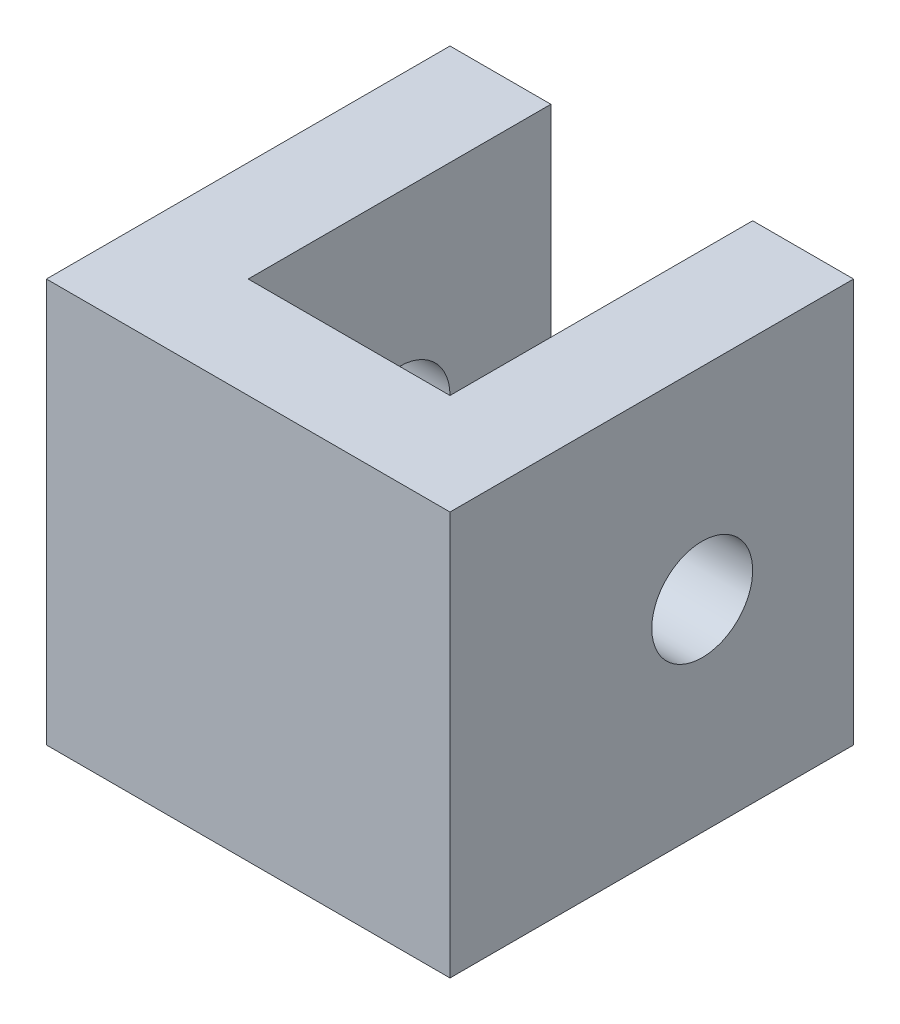
ISO-10303-21;
HEADER;
FILE_DESCRIPTION(('STEP AP214'),'2;1');
FILE_NAME('part.step','',(''),(''),'','','');
FILE_SCHEMA(('AUTOMOTIVE_DESIGN { 1 0 10303 214 1 1 1 1 }'));
ENDSEC;
DATA;
#1=APPLICATION_CONTEXT('core data for automotive mechanical design processes');
#2=APPLICATION_PROTOCOL_DEFINITION('international standard','automotive_design',2000,#1);
#3=PRODUCT_CONTEXT('',#1,'mechanical');
#4=PRODUCT('Part','Part','',(#3));
#5=PRODUCT_RELATED_PRODUCT_CATEGORY('part','',(#4));
#6=PRODUCT_DEFINITION_FORMATION('','',#4);
#7=PRODUCT_DEFINITION_CONTEXT('part definition',#1,'design');
#8=PRODUCT_DEFINITION('design','',#6,#7);
#9=PRODUCT_DEFINITION_SHAPE('','',#8);
#10=(LENGTH_UNIT() NAMED_UNIT(*) SI_UNIT(.MILLI.,.METRE.));
#11=(NAMED_UNIT(*) PLANE_ANGLE_UNIT() SI_UNIT($,.RADIAN.));
#12=(NAMED_UNIT(*) SI_UNIT($,.STERADIAN.) SOLID_ANGLE_UNIT());
#13=UNCERTAINTY_MEASURE_WITH_UNIT(LENGTH_MEASURE(1.E-05),#10,'distance_accuracy_value','');
#14=(GEOMETRIC_REPRESENTATION_CONTEXT(3) GLOBAL_UNCERTAINTY_ASSIGNED_CONTEXT((#13)) GLOBAL_UNIT_ASSIGNED_CONTEXT((#10,
#11,#12)) REPRESENTATION_CONTEXT('',''));
#15=CARTESIAN_POINT('',(0.,0.,0.));
#16=DIRECTION('',(0.,0.,1.));
#17=DIRECTION('',(1.,0.,0.));
#18=AXIS2_PLACEMENT_3D('',#15,#16,#17);
#19=CARTESIAN_POINT('',(-18.2955445544555,-12.7,-19.5529702970297));
#20=DIRECTION('',(0.,0.,-1.));
#21=DIRECTION('',(-1.,0.,0.));
#22=AXIS2_PLACEMENT_3D('',#19,#20,#21);
#23=PLANE('',#22);
#24=DIRECTION('',(0.,1.,0.));
#25=VECTOR('',#24,1.);
#26=CARTESIAN_POINT('',(-24.6455445544555,-12.7,-19.5529702970297));
#27=LINE('',#26,#25);
#28=CARTESIAN_POINT('',(-24.6455445544555,-12.7,-19.5529702970297));
#29=VERTEX_POINT('',#28);
#30=CARTESIAN_POINT('',(-24.6455445544555,12.7,-19.5529702970297));
#31=VERTEX_POINT('',#30);
#32=EDGE_CURVE('E37',#29,#31,#27,.T.);
#33=ORIENTED_EDGE('',*,*,#32,.T.);
#34=DIRECTION('',(-1.,0.,0.));
#35=VECTOR('',#34,1.);
#36=CARTESIAN_POINT('',(-18.2955445544555,12.7,-19.5529702970297));
#37=LINE('',#36,#35);
#38=CARTESIAN_POINT('',(-18.2955445544555,12.7,-19.5529702970297));
#39=VERTEX_POINT('',#38);
#40=EDGE_CURVE('E98',#39,#31,#37,.T.);
#41=ORIENTED_EDGE('',*,*,#40,.F.);
#42=DIRECTION('',(0.,1.,0.));
#43=VECTOR('',#42,1.);
#44=CARTESIAN_POINT('',(-18.2955445544555,-12.7,-19.5529702970297));
#45=LINE('',#44,#43);
#46=CARTESIAN_POINT('',(-18.2955445544555,-12.7,-19.5529702970297));
#47=VERTEX_POINT('',#46);
#48=EDGE_CURVE('E11',#47,#39,#45,.T.);
#49=ORIENTED_EDGE('',*,*,#48,.F.);
#50=DIRECTION('',(-1.,0.,0.));
#51=VECTOR('',#50,1.);
#52=CARTESIAN_POINT('',(-18.2955445544555,-12.7,-19.5529702970297));
#53=LINE('',#52,#51);
#54=EDGE_CURVE('E99',#47,#29,#53,.T.);
#55=ORIENTED_EDGE('',*,*,#54,.T.);
#56=EDGE_LOOP('',(#33,#41,#49,#55));
#57=FACE_BOUND('',#56,.T.);
#58=ADVANCED_FACE('F34',(#57),#23,.T.);
#59=CARTESIAN_POINT('',(-18.2955445544555,-12.7,-0.502970297029703));
#60=DIRECTION('',(1.,0.,0.));
#61=DIRECTION('',(0.,0.,-1.));
#62=AXIS2_PLACEMENT_3D('',#59,#60,#61);
#63=PLANE('',#62);
#64=CARTESIAN_POINT('',(-18.2955445544555,0.,-10.0279702970297));
#65=DIRECTION('',(1.,0.,0.));
#66=DIRECTION('',(0.,0.,-1.));
#67=AXIS2_PLACEMENT_3D('',#64,#65,#66);
#68=CIRCLE('',#67,3.175);
#69=CARTESIAN_POINT('',(-18.2955445544555,0.,-13.2029702970297));
#70=VERTEX_POINT('',#69);
#71=EDGE_CURVE('E117',#70,#70,#68,.T.);
#72=ORIENTED_EDGE('',*,*,#71,.F.);
#73=EDGE_LOOP('',(#72));
#74=FACE_BOUND('',#73,.T.);
#75=ORIENTED_EDGE('',*,*,#48,.T.);
#76=DIRECTION('',(0.,0.,-1.));
#77=VECTOR('',#76,1.);
#78=CARTESIAN_POINT('',(-18.2955445544555,12.7,-0.502970297029703));
#79=LINE('',#78,#77);
#80=CARTESIAN_POINT('',(-18.2955445544555,12.7,-0.502970297029703));
#81=VERTEX_POINT('',#80);
#82=EDGE_CURVE('E116',#81,#39,#79,.T.);
#83=ORIENTED_EDGE('',*,*,#82,.F.);
#84=DIRECTION('',(0.,1.,0.));
#85=VECTOR('',#84,1.);
#86=CARTESIAN_POINT('',(-18.2955445544555,-12.7,-0.502970297029703));
#87=LINE('',#86,#85);
#88=CARTESIAN_POINT('',(-18.2955445544555,-12.7,-0.502970297029703));
#89=VERTEX_POINT('',#88);
#90=EDGE_CURVE('E42',#89,#81,#87,.T.);
#91=ORIENTED_EDGE('',*,*,#90,.F.);
#92=DIRECTION('',(0.,0.,-1.));
#93=VECTOR('',#92,1.);
#94=CARTESIAN_POINT('',(-18.2955445544555,-12.7,-0.502970297029703));
#95=LINE('',#94,#93);
#96=EDGE_CURVE('E104',#89,#47,#95,.T.);
#97=ORIENTED_EDGE('',*,*,#96,.T.);
#98=EDGE_LOOP('',(#75,#83,#91,#97));
#99=FACE_BOUND('',#98,.T.);
#100=ADVANCED_FACE('F185',(#74,#99),#63,.T.);
#101=CARTESIAN_POINT('',(-5.59554455445548,-12.7,-0.502970297029706));
#102=DIRECTION('',(0.,0.,-1.));
#103=DIRECTION('',(-1.,0.,0.));
#104=AXIS2_PLACEMENT_3D('',#101,#102,#103);
#105=PLANE('',#104);
#106=ORIENTED_EDGE('',*,*,#90,.T.);
#107=DIRECTION('',(-1.,0.,0.));
#108=VECTOR('',#107,1.);
#109=CARTESIAN_POINT('',(-5.59554455445548,12.7,-0.502970297029706));
#110=LINE('',#109,#108);
#111=CARTESIAN_POINT('',(-5.59554455445548,12.7,-0.502970297029706));
#112=VERTEX_POINT('',#111);
#113=EDGE_CURVE('E134',#112,#81,#110,.T.);
#114=ORIENTED_EDGE('',*,*,#113,.F.);
#115=DIRECTION('',(0.,1.,0.));
#116=VECTOR('',#115,1.);
#117=CARTESIAN_POINT('',(-5.59554455445548,-12.7,-0.502970297029706));
#118=LINE('',#117,#116);
#119=CARTESIAN_POINT('',(-5.59554455445548,-12.7,-0.502970297029706));
#120=VERTEX_POINT('',#119);
#121=EDGE_CURVE('E156',#120,#112,#118,.T.);
#122=ORIENTED_EDGE('',*,*,#121,.F.);
#123=DIRECTION('',(-1.,0.,0.));
#124=VECTOR('',#123,1.);
#125=CARTESIAN_POINT('',(-5.59554455445548,-12.7,-0.502970297029706));
#126=LINE('',#125,#124);
#127=EDGE_CURVE('E152',#120,#89,#126,.T.);
#128=ORIENTED_EDGE('',*,*,#127,.T.);
#129=EDGE_LOOP('',(#106,#114,#122,#128));
#130=FACE_BOUND('',#129,.T.);
#131=ADVANCED_FACE('F184',(#130),#105,.T.);
#132=CARTESIAN_POINT('',(-5.59554455445548,-12.7,-19.5529702970297));
#133=DIRECTION('',(-1.,0.,0.));
#134=DIRECTION('',(0.,0.,1.));
#135=AXIS2_PLACEMENT_3D('',#132,#133,#134);
#136=PLANE('',#135);
#137=CARTESIAN_POINT('',(-5.59554455445548,0.,-10.0279702970297));
#138=DIRECTION('',(-1.,0.,0.));
#139=DIRECTION('',(0.,0.,1.));
#140=AXIS2_PLACEMENT_3D('',#137,#138,#139);
#141=CIRCLE('',#140,3.175);
#142=CARTESIAN_POINT('',(-5.59554455445548,0.,-6.85297029702971));
#143=VERTEX_POINT('',#142);
#144=EDGE_CURVE('E120',#143,#143,#141,.T.);
#145=ORIENTED_EDGE('',*,*,#144,.F.);
#146=EDGE_LOOP('',(#145));
#147=FACE_BOUND('',#146,.T.);
#148=ORIENTED_EDGE('',*,*,#121,.T.);
#149=DIRECTION('',(0.,0.,1.));
#150=VECTOR('',#149,1.);
#151=CARTESIAN_POINT('',(-5.59554455445548,12.7,-19.5529702970297));
#152=LINE('',#151,#150);
#153=CARTESIAN_POINT('',(-5.59554455445548,12.7,-19.5529702970297));
#154=VERTEX_POINT('',#153);
#155=EDGE_CURVE('E131',#154,#112,#152,.T.);
#156=ORIENTED_EDGE('',*,*,#155,.F.);
#157=DIRECTION('',(0.,1.,0.));
#158=VECTOR('',#157,1.);
#159=CARTESIAN_POINT('',(-5.59554455445548,-12.7,-19.5529702970297));
#160=LINE('',#159,#158);
#161=CARTESIAN_POINT('',(-5.59554455445548,-12.7,-19.5529702970297));
#162=VERTEX_POINT('',#161);
#163=EDGE_CURVE('E158',#162,#154,#160,.T.);
#164=ORIENTED_EDGE('',*,*,#163,.F.);
#165=DIRECTION('',(0.,0.,1.));
#166=VECTOR('',#165,1.);
#167=CARTESIAN_POINT('',(-5.59554455445548,-12.7,-19.5529702970297));
#168=LINE('',#167,#166);
#169=EDGE_CURVE('E149',#162,#120,#168,.T.);
#170=ORIENTED_EDGE('',*,*,#169,.T.);
#171=EDGE_LOOP('',(#148,#156,#164,#170));
#172=FACE_BOUND('',#171,.T.);
#173=ADVANCED_FACE('F180',(#147,#172),#136,.T.);
#174=CARTESIAN_POINT('',(0.754455445544521,-12.7,-19.5529702970297));
#175=DIRECTION('',(0.,0.,-1.));
#176=DIRECTION('',(-1.,0.,0.));
#177=AXIS2_PLACEMENT_3D('',#174,#175,#176);
#178=PLANE('',#177);
#179=ORIENTED_EDGE('',*,*,#163,.T.);
#180=DIRECTION('',(-1.,0.,0.));
#181=VECTOR('',#180,1.);
#182=CARTESIAN_POINT('',(0.754455445544521,12.7,-19.5529702970297));
#183=LINE('',#182,#181);
#184=CARTESIAN_POINT('',(0.754455445544521,12.7,-19.5529702970297));
#185=VERTEX_POINT('',#184);
#186=EDGE_CURVE('E128',#185,#154,#183,.T.);
#187=ORIENTED_EDGE('',*,*,#186,.F.);
#188=DIRECTION('',(0.,1.,0.));
#189=VECTOR('',#188,1.);
#190=CARTESIAN_POINT('',(0.754455445544521,-12.7,-19.5529702970297));
#191=LINE('',#190,#189);
#192=CARTESIAN_POINT('',(0.754455445544521,-12.7,-19.5529702970297));
#193=VERTEX_POINT('',#192);
#194=EDGE_CURVE('E160',#193,#185,#191,.T.);
#195=ORIENTED_EDGE('',*,*,#194,.F.);
#196=DIRECTION('',(-1.,0.,0.));
#197=VECTOR('',#196,1.);
#198=CARTESIAN_POINT('',(0.754455445544521,-12.7,-19.5529702970297));
#199=LINE('',#198,#197);
#200=EDGE_CURVE('E146',#193,#162,#199,.T.);
#201=ORIENTED_EDGE('',*,*,#200,.T.);
#202=EDGE_LOOP('',(#179,#187,#195,#201));
#203=FACE_BOUND('',#202,.T.);
#204=ADVANCED_FACE('F173',(#203),#178,.T.);
#205=CARTESIAN_POINT('',(0.754455445544521,-12.7,5.8470297029703));
#206=DIRECTION('',(1.,0.,0.));
#207=DIRECTION('',(0.,0.,-1.));
#208=AXIS2_PLACEMENT_3D('',#205,#206,#207);
#209=PLANE('',#208);
#210=CARTESIAN_POINT('',(0.754455445544519,0.,-10.0279702970297));
#211=DIRECTION('',(-1.,0.,0.));
#212=DIRECTION('',(0.,0.,1.));
#213=AXIS2_PLACEMENT_3D('',#210,#211,#212);
#214=CIRCLE('',#213,3.175);
#215=CARTESIAN_POINT('',(0.754455445544519,0.,-6.85297029702971));
#216=VERTEX_POINT('',#215);
#217=EDGE_CURVE('E216',#216,#216,#214,.T.);
#218=ORIENTED_EDGE('',*,*,#217,.T.);
#219=EDGE_LOOP('',(#218));
#220=FACE_BOUND('',#219,.T.);
#221=ORIENTED_EDGE('',*,*,#194,.T.);
#222=DIRECTION('',(0.,0.,-1.));
#223=VECTOR('',#222,1.);
#224=CARTESIAN_POINT('',(0.754455445544521,12.7,5.8470297029703));
#225=LINE('',#224,#223);
#226=CARTESIAN_POINT('',(0.754455445544521,12.7,5.8470297029703));
#227=VERTEX_POINT('',#226);
#228=EDGE_CURVE('E125',#227,#185,#225,.T.);
#229=ORIENTED_EDGE('',*,*,#228,.F.);
#230=DIRECTION('',(0.,1.,0.));
#231=VECTOR('',#230,1.);
#232=CARTESIAN_POINT('',(0.754455445544521,-12.7,5.8470297029703));
#233=LINE('',#232,#231);
#234=CARTESIAN_POINT('',(0.754455445544521,-12.7,5.8470297029703));
#235=VERTEX_POINT('',#234);
#236=EDGE_CURVE('E162',#235,#227,#233,.T.);
#237=ORIENTED_EDGE('',*,*,#236,.F.);
#238=DIRECTION('',(0.,0.,-1.));
#239=VECTOR('',#238,1.);
#240=CARTESIAN_POINT('',(0.754455445544521,-12.7,5.8470297029703));
#241=LINE('',#240,#239);
#242=EDGE_CURVE('E143',#235,#193,#241,.T.);
#243=ORIENTED_EDGE('',*,*,#242,.T.);
#244=EDGE_LOOP('',(#221,#229,#237,#243));
#245=FACE_BOUND('',#244,.T.);
#246=ADVANCED_FACE('F170',(#220,#245),#209,.T.);
#247=CARTESIAN_POINT('',(-24.6455445544555,-12.7,5.8470297029703));
#248=DIRECTION('',(0.,0.,1.));
#249=DIRECTION('',(1.,0.,0.));
#250=AXIS2_PLACEMENT_3D('',#247,#248,#249);
#251=PLANE('',#250);
#252=ORIENTED_EDGE('',*,*,#236,.T.);
#253=DIRECTION('',(1.,0.,0.));
#254=VECTOR('',#253,1.);
#255=CARTESIAN_POINT('',(-24.6455445544555,12.7,5.8470297029703));
#256=LINE('',#255,#254);
#257=CARTESIAN_POINT('',(-24.6455445544555,12.7,5.8470297029703));
#258=VERTEX_POINT('',#257);
#259=EDGE_CURVE('E111',#258,#227,#256,.T.);
#260=ORIENTED_EDGE('',*,*,#259,.F.);
#261=DIRECTION('',(0.,1.,0.));
#262=VECTOR('',#261,1.);
#263=CARTESIAN_POINT('',(-24.6455445544555,-12.7,5.8470297029703));
#264=LINE('',#263,#262);
#265=CARTESIAN_POINT('',(-24.6455445544555,-12.7,5.8470297029703));
#266=VERTEX_POINT('',#265);
#267=EDGE_CURVE('E103',#266,#258,#264,.T.);
#268=ORIENTED_EDGE('',*,*,#267,.F.);
#269=DIRECTION('',(1.,0.,0.));
#270=VECTOR('',#269,1.);
#271=CARTESIAN_POINT('',(-24.6455445544555,-12.7,5.8470297029703));
#272=LINE('',#271,#270);
#273=EDGE_CURVE('E140',#266,#235,#272,.T.);
#274=ORIENTED_EDGE('',*,*,#273,.T.);
#275=EDGE_LOOP('',(#252,#260,#268,#274));
#276=FACE_BOUND('',#275,.T.);
#277=ADVANCED_FACE('F164',(#276),#251,.T.);
#278=CARTESIAN_POINT('',(-24.6455445544555,-12.7,-19.5529702970297));
#279=DIRECTION('',(-1.,0.,0.));
#280=DIRECTION('',(0.,0.,1.));
#281=AXIS2_PLACEMENT_3D('',#278,#279,#280);
#282=PLANE('',#281);
#283=CARTESIAN_POINT('',(-24.6455445544555,0.,-10.0279702970297));
#284=DIRECTION('',(-1.,0.,0.));
#285=DIRECTION('',(0.,0.,1.));
#286=AXIS2_PLACEMENT_3D('',#283,#284,#285);
#287=CIRCLE('',#286,3.175);
#288=CARTESIAN_POINT('',(-24.6455445544555,0.,-6.85297029702971));
#289=VERTEX_POINT('',#288);
#290=EDGE_CURVE('E214',#289,#289,#287,.T.);
#291=ORIENTED_EDGE('',*,*,#290,.F.);
#292=EDGE_LOOP('',(#291));
#293=FACE_BOUND('',#292,.T.);
#294=ORIENTED_EDGE('',*,*,#267,.T.);
#295=DIRECTION('',(0.,0.,1.));
#296=VECTOR('',#295,1.);
#297=CARTESIAN_POINT('',(-24.6455445544555,12.7,-19.5529702970297));
#298=LINE('',#297,#296);
#299=EDGE_CURVE('E106',#31,#258,#298,.T.);
#300=ORIENTED_EDGE('',*,*,#299,.F.);
#301=ORIENTED_EDGE('',*,*,#32,.F.);
#302=DIRECTION('',(0.,0.,1.));
#303=VECTOR('',#302,1.);
#304=CARTESIAN_POINT('',(-24.6455445544555,-12.7,-19.5529702970297));
#305=LINE('',#304,#303);
#306=EDGE_CURVE('E138',#29,#266,#305,.T.);
#307=ORIENTED_EDGE('',*,*,#306,.T.);
#308=EDGE_LOOP('',(#294,#300,#301,#307));
#309=FACE_BOUND('',#308,.T.);
#310=ADVANCED_FACE('F107',(#293,#309),#282,.T.);
#311=CARTESIAN_POINT('',(0.,-12.7,0.));
#312=DIRECTION('',(0.,1.,0.));
#313=DIRECTION('',(0.,0.,1.));
#314=AXIS2_PLACEMENT_3D('',#311,#312,#313);
#315=PLANE('',#314);
#316=ORIENTED_EDGE('',*,*,#54,.F.);
#317=ORIENTED_EDGE('',*,*,#96,.F.);
#318=ORIENTED_EDGE('',*,*,#127,.F.);
#319=ORIENTED_EDGE('',*,*,#169,.F.);
#320=ORIENTED_EDGE('',*,*,#200,.F.);
#321=ORIENTED_EDGE('',*,*,#242,.F.);
#322=ORIENTED_EDGE('',*,*,#273,.F.);
#323=ORIENTED_EDGE('',*,*,#306,.F.);
#324=EDGE_LOOP('',(#316,#317,#318,#319,#320,#321,#322,#323));
#325=FACE_BOUND('',#324,.T.);
#326=ADVANCED_FACE('F176',(#325),#315,.F.);
#327=CARTESIAN_POINT('',(0.,12.7,0.));
#328=DIRECTION('',(0.,1.,0.));
#329=DIRECTION('',(0.,0.,1.));
#330=AXIS2_PLACEMENT_3D('',#327,#328,#329);
#331=PLANE('',#330);
#332=ORIENTED_EDGE('',*,*,#40,.T.);
#333=ORIENTED_EDGE('',*,*,#299,.T.);
#334=ORIENTED_EDGE('',*,*,#259,.T.);
#335=ORIENTED_EDGE('',*,*,#228,.T.);
#336=ORIENTED_EDGE('',*,*,#186,.T.);
#337=ORIENTED_EDGE('',*,*,#155,.T.);
#338=ORIENTED_EDGE('',*,*,#113,.T.);
#339=ORIENTED_EDGE('',*,*,#82,.T.);
#340=EDGE_LOOP('',(#332,#333,#334,#335,#336,#337,#338,#339));
#341=FACE_BOUND('',#340,.T.);
#342=ADVANCED_FACE('F114',(#341),#331,.T.);
#343=CARTESIAN_POINT('',(0.754455445544519,0.,-10.0279702970297));
#344=DIRECTION('',(-1.,0.,0.));
#345=DIRECTION('',(0.,0.,1.));
#346=AXIS2_PLACEMENT_3D('',#343,#344,#345);
#347=CYLINDRICAL_SURFACE('',#346,3.175);
#348=ORIENTED_EDGE('',*,*,#71,.T.);
#349=EDGE_LOOP('',(#348));
#350=FACE_BOUND('',#349,.T.);
#351=ORIENTED_EDGE('',*,*,#290,.T.);
#352=EDGE_LOOP('',(#351));
#353=FACE_BOUND('',#352,.T.);
#354=ADVANCED_FACE('F226',(#350,#353),#347,.F.);
#355=ORIENTED_EDGE('',*,*,#144,.T.);
#356=EDGE_LOOP('',(#355));
#357=FACE_BOUND('',#356,.T.);
#358=ORIENTED_EDGE('',*,*,#217,.F.);
#359=EDGE_LOOP('',(#358));
#360=FACE_BOUND('',#359,.T.);
#361=ADVANCED_FACE('F223',(#357,#360),#347,.F.);
#362=CLOSED_SHELL('',(#58,#100,#131,#173,#204,#246,#277,#310,#326,#342,#354,#361));
#363=MANIFOLD_SOLID_BREP('B2',#362);
#364=ADVANCED_BREP_SHAPE_REPRESENTATION('',(#18,#363),#14);
#365=SHAPE_DEFINITION_REPRESENTATION(#9,#364);
ENDSEC;
END-ISO-10303-21;
